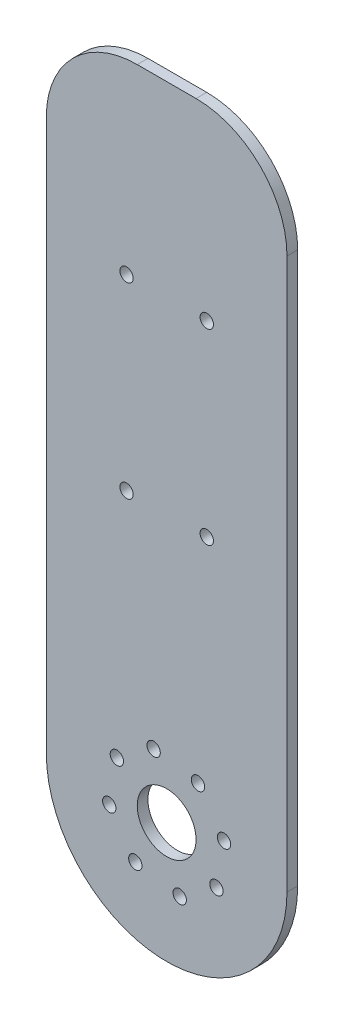
ISO-10303-21;
HEADER;
FILE_DESCRIPTION(('STEP AP214'),'2;1');
FILE_NAME('part.step','',(''),(''),'','','');
FILE_SCHEMA(('AUTOMOTIVE_DESIGN { 1 0 10303 214 1 1 1 1 }'));
ENDSEC;
DATA;
#1=APPLICATION_CONTEXT('core data for automotive mechanical design processes');
#2=APPLICATION_PROTOCOL_DEFINITION('international standard','automotive_design',2000,#1);
#3=PRODUCT_CONTEXT('',#1,'mechanical');
#4=PRODUCT('Part','Part','',(#3));
#5=PRODUCT_RELATED_PRODUCT_CATEGORY('part','',(#4));
#6=PRODUCT_DEFINITION_FORMATION('','',#4);
#7=PRODUCT_DEFINITION_CONTEXT('part definition',#1,'design');
#8=PRODUCT_DEFINITION('design','',#6,#7);
#9=PRODUCT_DEFINITION_SHAPE('','',#8);
#10=(LENGTH_UNIT() NAMED_UNIT(*) SI_UNIT(.MILLI.,.METRE.));
#11=(NAMED_UNIT(*) PLANE_ANGLE_UNIT() SI_UNIT($,.RADIAN.));
#12=(NAMED_UNIT(*) SI_UNIT($,.STERADIAN.) SOLID_ANGLE_UNIT());
#13=UNCERTAINTY_MEASURE_WITH_UNIT(LENGTH_MEASURE(1.E-05),#10,'distance_accuracy_value','');
#14=(GEOMETRIC_REPRESENTATION_CONTEXT(3) GLOBAL_UNCERTAINTY_ASSIGNED_CONTEXT((#13)) GLOBAL_UNIT_ASSIGNED_CONTEXT((#10,
#11,#12)) REPRESENTATION_CONTEXT('',''));
#15=CARTESIAN_POINT('',(0.,0.,0.));
#16=DIRECTION('',(0.,0.,1.));
#17=DIRECTION('',(1.,0.,0.));
#18=AXIS2_PLACEMENT_3D('',#15,#16,#17);
#19=CARTESIAN_POINT('',(3.,80.,1.));
#20=DIRECTION('',(0.,0.,1.));
#21=DIRECTION('',(1.,0.,0.));
#22=AXIS2_PLACEMENT_3D('',#19,#20,#21);
#23=CYLINDRICAL_SURFACE('',#22,17.);
#24=DIRECTION('',(0.,0.,1.));
#25=VECTOR('',#24,1.);
#26=CARTESIAN_POINT('',(20.,80.,1.));
#27=LINE('',#26,#25);
#28=CARTESIAN_POINT('',(20.,80.,-1.));
#29=VERTEX_POINT('',#28);
#30=CARTESIAN_POINT('',(20.,80.,1.));
#31=VERTEX_POINT('',#30);
#32=EDGE_CURVE('E11',#29,#31,#27,.T.);
#33=ORIENTED_EDGE('',*,*,#32,.F.);
#34=CARTESIAN_POINT('',(3.,80.,-1.));
#35=DIRECTION('',(0.,0.,1.));
#36=DIRECTION('',(1.,0.,0.));
#37=AXIS2_PLACEMENT_3D('',#34,#35,#36);
#38=CIRCLE('',#37,17.);
#39=CARTESIAN_POINT('',(3.,97.,-1.));
#40=VERTEX_POINT('',#39);
#41=EDGE_CURVE('E105',#29,#40,#38,.T.);
#42=ORIENTED_EDGE('',*,*,#41,.T.);
#43=DIRECTION('',(0.,0.,1.));
#44=VECTOR('',#43,1.);
#45=CARTESIAN_POINT('',(3.,97.,1.));
#46=LINE('',#45,#44);
#47=CARTESIAN_POINT('',(3.,97.,1.));
#48=VERTEX_POINT('',#47);
#49=EDGE_CURVE('E54',#40,#48,#46,.T.);
#50=ORIENTED_EDGE('',*,*,#49,.T.);
#51=CARTESIAN_POINT('',(3.,80.,1.));
#52=DIRECTION('',(0.,0.,1.));
#53=DIRECTION('',(1.,0.,0.));
#54=AXIS2_PLACEMENT_3D('',#51,#52,#53);
#55=CIRCLE('',#54,17.);
#56=EDGE_CURVE('E135',#31,#48,#55,.T.);
#57=ORIENTED_EDGE('',*,*,#56,.F.);
#58=EDGE_LOOP('',(#33,#42,#50,#57));
#59=FACE_BOUND('',#58,.T.);
#60=ADVANCED_FACE('F44',(#59),#23,.T.);
#61=CARTESIAN_POINT('',(-8.,97.,1.));
#62=DIRECTION('',(0.,1.,0.));
#63=DIRECTION('',(-1.,0.,0.));
#64=AXIS2_PLACEMENT_3D('',#61,#62,#63);
#65=PLANE('',#64);
#66=ORIENTED_EDGE('',*,*,#49,.F.);
#67=DIRECTION('',(1.,0.,0.));
#68=VECTOR('',#67,1.);
#69=CARTESIAN_POINT('',(-2.5,97.,-1.));
#70=LINE('',#69,#68);
#71=CARTESIAN_POINT('',(-8.,97.,-1.));
#72=VERTEX_POINT('',#71);
#73=EDGE_CURVE('E121',#40,#72,#70,.F.);
#74=ORIENTED_EDGE('',*,*,#73,.T.);
#75=DIRECTION('',(0.,0.,1.));
#76=VECTOR('',#75,1.);
#77=CARTESIAN_POINT('',(-8.,97.,1.));
#78=LINE('',#77,#76);
#79=CARTESIAN_POINT('',(-8.,97.,1.));
#80=VERTEX_POINT('',#79);
#81=EDGE_CURVE('E128',#72,#80,#78,.T.);
#82=ORIENTED_EDGE('',*,*,#81,.T.);
#83=DIRECTION('',(-1.,0.,0.));
#84=VECTOR('',#83,1.);
#85=CARTESIAN_POINT('',(-8.,97.,1.));
#86=LINE('',#85,#84);
#87=EDGE_CURVE('E143',#48,#80,#86,.T.);
#88=ORIENTED_EDGE('',*,*,#87,.F.);
#89=EDGE_LOOP('',(#66,#74,#82,#88));
#90=FACE_BOUND('',#89,.T.);
#91=ADVANCED_FACE('F146',(#90),#65,.T.);
#92=CARTESIAN_POINT('',(-8.,80.,1.));
#93=DIRECTION('',(0.,0.,1.));
#94=DIRECTION('',(1.,0.,0.));
#95=AXIS2_PLACEMENT_3D('',#92,#93,#94);
#96=CYLINDRICAL_SURFACE('',#95,17.);
#97=ORIENTED_EDGE('',*,*,#81,.F.);
#98=CARTESIAN_POINT('',(-8.,80.,-1.));
#99=DIRECTION('',(0.,0.,1.));
#100=DIRECTION('',(1.,0.,0.));
#101=AXIS2_PLACEMENT_3D('',#98,#99,#100);
#102=CIRCLE('',#101,17.);
#103=CARTESIAN_POINT('',(-25.,80.,-1.));
#104=VERTEX_POINT('',#103);
#105=EDGE_CURVE('E118',#72,#104,#102,.T.);
#106=ORIENTED_EDGE('',*,*,#105,.T.);
#107=DIRECTION('',(0.,0.,1.));
#108=VECTOR('',#107,1.);
#109=CARTESIAN_POINT('',(-25.,80.,1.));
#110=LINE('',#109,#108);
#111=CARTESIAN_POINT('',(-25.,80.,1.));
#112=VERTEX_POINT('',#111);
#113=EDGE_CURVE('E126',#104,#112,#110,.T.);
#114=ORIENTED_EDGE('',*,*,#113,.T.);
#115=CARTESIAN_POINT('',(-8.,80.,1.));
#116=DIRECTION('',(0.,0.,1.));
#117=DIRECTION('',(-1.,0.,0.));
#118=AXIS2_PLACEMENT_3D('',#115,#116,#117);
#119=CIRCLE('',#118,17.);
#120=EDGE_CURVE('E147',#80,#112,#119,.T.);
#121=ORIENTED_EDGE('',*,*,#120,.F.);
#122=EDGE_LOOP('',(#97,#106,#114,#121));
#123=FACE_BOUND('',#122,.T.);
#124=ADVANCED_FACE('F214',(#123),#96,.T.);
#125=CARTESIAN_POINT('',(-25.,-23.,1.));
#126=DIRECTION('',(-1.,0.,0.));
#127=DIRECTION('',(0.,-1.,0.));
#128=AXIS2_PLACEMENT_3D('',#125,#126,#127);
#129=PLANE('',#128);
#130=ORIENTED_EDGE('',*,*,#113,.F.);
#131=DIRECTION('',(0.,1.,0.));
#132=VECTOR('',#131,1.);
#133=CARTESIAN_POINT('',(-25.,-23.,-1.));
#134=LINE('',#133,#132);
#135=CARTESIAN_POINT('',(-25.,-23.,-1.));
#136=VERTEX_POINT('',#135);
#137=EDGE_CURVE('E115',#104,#136,#134,.F.);
#138=ORIENTED_EDGE('',*,*,#137,.T.);
#139=DIRECTION('',(0.,0.,1.));
#140=VECTOR('',#139,1.);
#141=CARTESIAN_POINT('',(-25.,-23.,1.));
#142=LINE('',#141,#140);
#143=CARTESIAN_POINT('',(-25.,-23.,1.));
#144=VERTEX_POINT('',#143);
#145=EDGE_CURVE('E62',#136,#144,#142,.T.);
#146=ORIENTED_EDGE('',*,*,#145,.T.);
#147=DIRECTION('',(0.,-1.,0.));
#148=VECTOR('',#147,1.);
#149=CARTESIAN_POINT('',(-25.,-23.,1.));
#150=LINE('',#149,#148);
#151=EDGE_CURVE('E98',#112,#144,#150,.T.);
#152=ORIENTED_EDGE('',*,*,#151,.F.);
#153=EDGE_LOOP('',(#130,#138,#146,#152));
#154=FACE_BOUND('',#153,.T.);
#155=ADVANCED_FACE('F219',(#154),#129,.T.);
#156=CARTESIAN_POINT('',(-2.5,-23.,1.));
#157=DIRECTION('',(0.,0.,1.));
#158=DIRECTION('',(1.,0.,0.));
#159=AXIS2_PLACEMENT_3D('',#156,#157,#158);
#160=CYLINDRICAL_SURFACE('',#159,22.5);
#161=ORIENTED_EDGE('',*,*,#145,.F.);
#162=CARTESIAN_POINT('',(-2.5,-23.,-1.));
#163=DIRECTION('',(0.,0.,1.));
#164=DIRECTION('',(1.,0.,0.));
#165=AXIS2_PLACEMENT_3D('',#162,#163,#164);
#166=CIRCLE('',#165,22.5);
#167=CARTESIAN_POINT('',(20.,-23.,-1.));
#168=VERTEX_POINT('',#167);
#169=EDGE_CURVE('E103',#136,#168,#166,.T.);
#170=ORIENTED_EDGE('',*,*,#169,.T.);
#171=DIRECTION('',(0.,0.,1.));
#172=VECTOR('',#171,1.);
#173=CARTESIAN_POINT('',(20.,-23.,1.));
#174=LINE('',#173,#172);
#175=CARTESIAN_POINT('',(20.,-23.,1.));
#176=VERTEX_POINT('',#175);
#177=EDGE_CURVE('E48',#168,#176,#174,.T.);
#178=ORIENTED_EDGE('',*,*,#177,.T.);
#179=CARTESIAN_POINT('',(-2.5,-23.,1.));
#180=DIRECTION('',(0.,0.,1.));
#181=DIRECTION('',(1.,0.,0.));
#182=AXIS2_PLACEMENT_3D('',#179,#180,#181);
#183=CIRCLE('',#182,22.5);
#184=EDGE_CURVE('E295',#144,#176,#183,.T.);
#185=ORIENTED_EDGE('',*,*,#184,.F.);
#186=EDGE_LOOP('',(#161,#170,#178,#185));
#187=FACE_BOUND('',#186,.T.);
#188=ADVANCED_FACE('F107',(#187),#160,.T.);
#189=CARTESIAN_POINT('',(-10.,27.,1.));
#190=DIRECTION('',(0.,0.,1.));
#191=DIRECTION('',(1.,0.,0.));
#192=AXIS2_PLACEMENT_3D('',#189,#190,#191);
#193=CYLINDRICAL_SURFACE('',#192,1.25);
#194=CARTESIAN_POINT('',(-10.,27.,1.));
#195=DIRECTION('',(0.,0.,1.));
#196=DIRECTION('',(1.,0.,0.));
#197=AXIS2_PLACEMENT_3D('',#194,#195,#196);
#198=CIRCLE('',#197,1.25);
#199=CARTESIAN_POINT('',(-8.75,27.,1.));
#200=VERTEX_POINT('',#199);
#201=EDGE_CURVE('E117',#200,#200,#198,.T.);
#202=ORIENTED_EDGE('',*,*,#201,.T.);
#203=EDGE_LOOP('',(#202));
#204=FACE_BOUND('',#203,.T.);
#205=CARTESIAN_POINT('',(-10.,27.,-1.));
#206=DIRECTION('',(0.,0.,1.));
#207=DIRECTION('',(1.,0.,0.));
#208=AXIS2_PLACEMENT_3D('',#205,#206,#207);
#209=CIRCLE('',#208,1.25);
#210=CARTESIAN_POINT('',(-8.75,27.,-1.));
#211=VERTEX_POINT('',#210);
#212=EDGE_CURVE('E154',#211,#211,#209,.T.);
#213=ORIENTED_EDGE('',*,*,#212,.F.);
#214=EDGE_LOOP('',(#213));
#215=FACE_BOUND('',#214,.T.);
#216=ADVANCED_FACE('F223',(#204,#215),#193,.F.);
#217=CARTESIAN_POINT('',(5.,62.,1.));
#218=DIRECTION('',(0.,0.,1.));
#219=DIRECTION('',(1.,0.,0.));
#220=AXIS2_PLACEMENT_3D('',#217,#218,#219);
#221=CYLINDRICAL_SURFACE('',#220,1.25);
#222=CARTESIAN_POINT('',(5.,62.,1.));
#223=DIRECTION('',(0.,0.,1.));
#224=DIRECTION('',(1.,0.,0.));
#225=AXIS2_PLACEMENT_3D('',#222,#223,#224);
#226=CIRCLE('',#225,1.25);
#227=CARTESIAN_POINT('',(6.25,62.,1.));
#228=VERTEX_POINT('',#227);
#229=EDGE_CURVE('E309',#228,#228,#226,.T.);
#230=ORIENTED_EDGE('',*,*,#229,.T.);
#231=EDGE_LOOP('',(#230));
#232=FACE_BOUND('',#231,.T.);
#233=CARTESIAN_POINT('',(5.,62.,-1.));
#234=DIRECTION('',(0.,0.,1.));
#235=DIRECTION('',(1.,0.,0.));
#236=AXIS2_PLACEMENT_3D('',#233,#234,#235);
#237=CIRCLE('',#236,1.25);
#238=CARTESIAN_POINT('',(6.25,62.,-1.));
#239=VERTEX_POINT('',#238);
#240=EDGE_CURVE('E157',#239,#239,#237,.T.);
#241=ORIENTED_EDGE('',*,*,#240,.F.);
#242=EDGE_LOOP('',(#241));
#243=FACE_BOUND('',#242,.T.);
#244=ADVANCED_FACE('F227',(#232,#243),#221,.F.);
#245=CARTESIAN_POINT('',(5.,27.,1.));
#246=DIRECTION('',(0.,0.,1.));
#247=DIRECTION('',(1.,0.,0.));
#248=AXIS2_PLACEMENT_3D('',#245,#246,#247);
#249=CYLINDRICAL_SURFACE('',#248,1.25);
#250=CARTESIAN_POINT('',(5.,27.,1.));
#251=DIRECTION('',(0.,0.,1.));
#252=DIRECTION('',(1.,0.,0.));
#253=AXIS2_PLACEMENT_3D('',#250,#251,#252);
#254=CIRCLE('',#253,1.25);
#255=CARTESIAN_POINT('',(6.25,27.,1.));
#256=VERTEX_POINT('',#255);
#257=EDGE_CURVE('E313',#256,#256,#254,.T.);
#258=ORIENTED_EDGE('',*,*,#257,.T.);
#259=EDGE_LOOP('',(#258));
#260=FACE_BOUND('',#259,.T.);
#261=CARTESIAN_POINT('',(5.,27.,-1.));
#262=DIRECTION('',(0.,0.,1.));
#263=DIRECTION('',(1.,0.,0.));
#264=AXIS2_PLACEMENT_3D('',#261,#262,#263);
#265=CIRCLE('',#264,1.25);
#266=CARTESIAN_POINT('',(6.25,27.,-1.));
#267=VERTEX_POINT('',#266);
#268=EDGE_CURVE('E160',#267,#267,#265,.T.);
#269=ORIENTED_EDGE('',*,*,#268,.F.);
#270=EDGE_LOOP('',(#269));
#271=FACE_BOUND('',#270,.T.);
#272=ADVANCED_FACE('F233',(#260,#271),#249,.F.);
#273=CARTESIAN_POINT('',(-10.,62.,1.));
#274=DIRECTION('',(0.,0.,1.));
#275=DIRECTION('',(1.,0.,0.));
#276=AXIS2_PLACEMENT_3D('',#273,#274,#275);
#277=CYLINDRICAL_SURFACE('',#276,1.25);
#278=CARTESIAN_POINT('',(-10.,62.,1.));
#279=DIRECTION('',(0.,0.,1.));
#280=DIRECTION('',(1.,0.,0.));
#281=AXIS2_PLACEMENT_3D('',#278,#279,#280);
#282=CIRCLE('',#281,1.25);
#283=CARTESIAN_POINT('',(-8.75,62.,1.));
#284=VERTEX_POINT('',#283);
#285=EDGE_CURVE('E317',#284,#284,#282,.T.);
#286=ORIENTED_EDGE('',*,*,#285,.T.);
#287=EDGE_LOOP('',(#286));
#288=FACE_BOUND('',#287,.T.);
#289=CARTESIAN_POINT('',(-10.,62.,-1.));
#290=DIRECTION('',(0.,0.,1.));
#291=DIRECTION('',(1.,0.,0.));
#292=AXIS2_PLACEMENT_3D('',#289,#290,#291);
#293=CIRCLE('',#292,1.25);
#294=CARTESIAN_POINT('',(-8.75,62.,-1.));
#295=VERTEX_POINT('',#294);
#296=EDGE_CURVE('E163',#295,#295,#293,.T.);
#297=ORIENTED_EDGE('',*,*,#296,.F.);
#298=EDGE_LOOP('',(#297));
#299=FACE_BOUND('',#298,.T.);
#300=ADVANCED_FACE('F242',(#288,#299),#277,.F.);
#301=CARTESIAN_POINT('',(-8.36094596654753,-32.3085612409873,1.));
#302=DIRECTION('',(0.,0.,1.));
#303=DIRECTION('',(1.,0.,0.));
#304=AXIS2_PLACEMENT_3D('',#301,#302,#303);
#305=CYLINDRICAL_SURFACE('',#304,1.25);
#306=CARTESIAN_POINT('',(-8.36094596654753,-32.3085612409873,1.));
#307=DIRECTION('',(0.,0.,-1.));
#308=DIRECTION('',(-1.,0.,0.));
#309=AXIS2_PLACEMENT_3D('',#306,#307,#308);
#310=CIRCLE('',#309,1.25);
#311=CARTESIAN_POINT('',(-9.61094596654753,-32.3085612409873,1.));
#312=VERTEX_POINT('',#311);
#313=EDGE_CURVE('E321',#312,#312,#310,.T.);
#314=ORIENTED_EDGE('',*,*,#313,.F.);
#315=EDGE_LOOP('',(#314));
#316=FACE_BOUND('',#315,.T.);
#317=CARTESIAN_POINT('',(-8.36094596654753,-32.3085612409873,-1.));
#318=DIRECTION('',(0.,0.,-1.));
#319=DIRECTION('',(-1.,0.,0.));
#320=AXIS2_PLACEMENT_3D('',#317,#318,#319);
#321=CIRCLE('',#320,1.25);
#322=CARTESIAN_POINT('',(-9.61094596654753,-32.3085612409873,-1.));
#323=VERTEX_POINT('',#322);
#324=EDGE_CURVE('E166',#323,#323,#321,.T.);
#325=ORIENTED_EDGE('',*,*,#324,.T.);
#326=EDGE_LOOP('',(#325));
#327=FACE_BOUND('',#326,.T.);
#328=ADVANCED_FACE('F246',(#316,#327),#305,.F.);
#329=CARTESIAN_POINT('',(-13.2264614137061,-25.4378321394787,1.));
#330=DIRECTION('',(0.,0.,1.));
#331=DIRECTION('',(1.,0.,0.));
#332=AXIS2_PLACEMENT_3D('',#329,#330,#331);
#333=CYLINDRICAL_SURFACE('',#332,1.25);
#334=CARTESIAN_POINT('',(-13.2264614137061,-25.4378321394787,1.));
#335=DIRECTION('',(0.,0.,-1.));
#336=DIRECTION('',(-1.,0.,0.));
#337=AXIS2_PLACEMENT_3D('',#334,#335,#336);
#338=CIRCLE('',#337,1.25);
#339=CARTESIAN_POINT('',(-14.4764614137061,-25.4378321394787,1.));
#340=VERTEX_POINT('',#339);
#341=EDGE_CURVE('E325',#340,#340,#338,.T.);
#342=ORIENTED_EDGE('',*,*,#341,.F.);
#343=EDGE_LOOP('',(#342));
#344=FACE_BOUND('',#343,.T.);
#345=CARTESIAN_POINT('',(-13.2264614137061,-25.4378321394787,-1.));
#346=DIRECTION('',(0.,0.,-1.));
#347=DIRECTION('',(-1.,0.,0.));
#348=AXIS2_PLACEMENT_3D('',#345,#346,#347);
#349=CIRCLE('',#348,1.25);
#350=CARTESIAN_POINT('',(-14.4764614137061,-25.4378321394787,-1.));
#351=VERTEX_POINT('',#350);
#352=EDGE_CURVE('E169',#351,#351,#349,.T.);
#353=ORIENTED_EDGE('',*,*,#352,.T.);
#354=EDGE_LOOP('',(#353));
#355=FACE_BOUND('',#354,.T.);
#356=ADVANCED_FACE('F250',(#344,#355),#333,.F.);
#357=CARTESIAN_POINT('',(-11.8085612409873,-17.1390540334525,1.));
#358=DIRECTION('',(0.,0.,1.));
#359=DIRECTION('',(1.,0.,0.));
#360=AXIS2_PLACEMENT_3D('',#357,#358,#359);
#361=CYLINDRICAL_SURFACE('',#360,1.25);
#362=CARTESIAN_POINT('',(-11.8085612409873,-17.1390540334525,1.));
#363=DIRECTION('',(0.,0.,-1.));
#364=DIRECTION('',(-1.,0.,0.));
#365=AXIS2_PLACEMENT_3D('',#362,#363,#364);
#366=CIRCLE('',#365,1.25);
#367=CARTESIAN_POINT('',(-13.0585612409873,-17.1390540334525,1.));
#368=VERTEX_POINT('',#367);
#369=EDGE_CURVE('E329',#368,#368,#366,.T.);
#370=ORIENTED_EDGE('',*,*,#369,.F.);
#371=EDGE_LOOP('',(#370));
#372=FACE_BOUND('',#371,.T.);
#373=CARTESIAN_POINT('',(-11.8085612409873,-17.1390540334525,-1.));
#374=DIRECTION('',(0.,0.,-1.));
#375=DIRECTION('',(-1.,0.,0.));
#376=AXIS2_PLACEMENT_3D('',#373,#374,#375);
#377=CIRCLE('',#376,1.25);
#378=CARTESIAN_POINT('',(-13.0585612409873,-17.1390540334525,-1.));
#379=VERTEX_POINT('',#378);
#380=EDGE_CURVE('E172',#379,#379,#377,.T.);
#381=ORIENTED_EDGE('',*,*,#380,.T.);
#382=EDGE_LOOP('',(#381));
#383=FACE_BOUND('',#382,.T.);
#384=ADVANCED_FACE('F254',(#372,#383),#361,.F.);
#385=CARTESIAN_POINT('',(-4.93783213947865,-12.273538586294,1.));
#386=DIRECTION('',(0.,0.,1.));
#387=DIRECTION('',(1.,0.,0.));
#388=AXIS2_PLACEMENT_3D('',#385,#386,#387);
#389=CYLINDRICAL_SURFACE('',#388,1.25);
#390=CARTESIAN_POINT('',(-4.93783213947865,-12.273538586294,1.));
#391=DIRECTION('',(0.,0.,-1.));
#392=DIRECTION('',(-1.,0.,0.));
#393=AXIS2_PLACEMENT_3D('',#390,#391,#392);
#394=CIRCLE('',#393,1.25);
#395=CARTESIAN_POINT('',(-6.18783213947865,-12.273538586294,1.));
#396=VERTEX_POINT('',#395);
#397=EDGE_CURVE('E333',#396,#396,#394,.T.);
#398=ORIENTED_EDGE('',*,*,#397,.F.);
#399=EDGE_LOOP('',(#398));
#400=FACE_BOUND('',#399,.T.);
#401=CARTESIAN_POINT('',(-4.93783213947865,-12.273538586294,-1.));
#402=DIRECTION('',(0.,0.,-1.));
#403=DIRECTION('',(-1.,0.,0.));
#404=AXIS2_PLACEMENT_3D('',#401,#402,#403);
#405=CIRCLE('',#404,1.25);
#406=CARTESIAN_POINT('',(-6.18783213947865,-12.273538586294,-1.));
#407=VERTEX_POINT('',#406);
#408=EDGE_CURVE('E175',#407,#407,#405,.T.);
#409=ORIENTED_EDGE('',*,*,#408,.T.);
#410=EDGE_LOOP('',(#409));
#411=FACE_BOUND('',#410,.T.);
#412=ADVANCED_FACE('F258',(#400,#411),#389,.F.);
#413=CARTESIAN_POINT('',(3.36094596654752,-13.6914387590128,1.));
#414=DIRECTION('',(0.,0.,1.));
#415=DIRECTION('',(1.,0.,0.));
#416=AXIS2_PLACEMENT_3D('',#413,#414,#415);
#417=CYLINDRICAL_SURFACE('',#416,1.25);
#418=CARTESIAN_POINT('',(3.36094596654752,-13.6914387590128,1.));
#419=DIRECTION('',(0.,0.,-1.));
#420=DIRECTION('',(-1.,0.,0.));
#421=AXIS2_PLACEMENT_3D('',#418,#419,#420);
#422=CIRCLE('',#421,1.25);
#423=CARTESIAN_POINT('',(2.11094596654752,-13.6914387590128,1.));
#424=VERTEX_POINT('',#423);
#425=EDGE_CURVE('E289',#424,#424,#422,.T.);
#426=ORIENTED_EDGE('',*,*,#425,.F.);
#427=EDGE_LOOP('',(#426));
#428=FACE_BOUND('',#427,.T.);
#429=CARTESIAN_POINT('',(3.36094596654752,-13.6914387590128,-1.));
#430=DIRECTION('',(0.,0.,-1.));
#431=DIRECTION('',(-1.,0.,0.));
#432=AXIS2_PLACEMENT_3D('',#429,#430,#431);
#433=CIRCLE('',#432,1.25);
#434=CARTESIAN_POINT('',(2.11094596654752,-13.6914387590128,-1.));
#435=VERTEX_POINT('',#434);
#436=EDGE_CURVE('E178',#435,#435,#433,.T.);
#437=ORIENTED_EDGE('',*,*,#436,.T.);
#438=EDGE_LOOP('',(#437));
#439=FACE_BOUND('',#438,.T.);
#440=ADVANCED_FACE('F262',(#428,#439),#417,.F.);
#441=CARTESIAN_POINT('',(8.22646141370605,-20.5621678605214,1.));
#442=DIRECTION('',(0.,0.,1.));
#443=DIRECTION('',(1.,0.,0.));
#444=AXIS2_PLACEMENT_3D('',#441,#442,#443);
#445=CYLINDRICAL_SURFACE('',#444,1.25);
#446=CARTESIAN_POINT('',(8.22646141370605,-20.5621678605214,1.));
#447=DIRECTION('',(0.,0.,-1.));
#448=DIRECTION('',(-1.,0.,0.));
#449=AXIS2_PLACEMENT_3D('',#446,#447,#448);
#450=CIRCLE('',#449,1.25);
#451=CARTESIAN_POINT('',(6.97646141370605,-20.5621678605214,1.));
#452=VERTEX_POINT('',#451);
#453=EDGE_CURVE('E283',#452,#452,#450,.T.);
#454=ORIENTED_EDGE('',*,*,#453,.F.);
#455=EDGE_LOOP('',(#454));
#456=FACE_BOUND('',#455,.T.);
#457=CARTESIAN_POINT('',(8.22646141370605,-20.5621678605214,-1.));
#458=DIRECTION('',(0.,0.,-1.));
#459=DIRECTION('',(-1.,0.,0.));
#460=AXIS2_PLACEMENT_3D('',#457,#458,#459);
#461=CIRCLE('',#460,1.25);
#462=CARTESIAN_POINT('',(6.97646141370605,-20.5621678605214,-1.));
#463=VERTEX_POINT('',#462);
#464=EDGE_CURVE('E181',#463,#463,#461,.T.);
#465=ORIENTED_EDGE('',*,*,#464,.T.);
#466=EDGE_LOOP('',(#465));
#467=FACE_BOUND('',#466,.T.);
#468=ADVANCED_FACE('F266',(#456,#467),#445,.F.);
#469=CARTESIAN_POINT('',(6.80856124098725,-28.8609459665476,1.));
#470=DIRECTION('',(0.,0.,1.));
#471=DIRECTION('',(1.,0.,0.));
#472=AXIS2_PLACEMENT_3D('',#469,#470,#471);
#473=CYLINDRICAL_SURFACE('',#472,1.25);
#474=CARTESIAN_POINT('',(6.80856124098725,-28.8609459665476,1.));
#475=DIRECTION('',(0.,0.,-1.));
#476=DIRECTION('',(-1.,0.,0.));
#477=AXIS2_PLACEMENT_3D('',#474,#475,#476);
#478=CIRCLE('',#477,1.25);
#479=CARTESIAN_POINT('',(5.55856124098725,-28.8609459665476,1.));
#480=VERTEX_POINT('',#479);
#481=EDGE_CURVE('E278',#480,#480,#478,.T.);
#482=ORIENTED_EDGE('',*,*,#481,.F.);
#483=EDGE_LOOP('',(#482));
#484=FACE_BOUND('',#483,.T.);
#485=CARTESIAN_POINT('',(6.80856124098725,-28.8609459665476,-1.));
#486=DIRECTION('',(0.,0.,-1.));
#487=DIRECTION('',(-1.,0.,0.));
#488=AXIS2_PLACEMENT_3D('',#485,#486,#487);
#489=CIRCLE('',#488,1.25);
#490=CARTESIAN_POINT('',(5.55856124098725,-28.8609459665476,-1.));
#491=VERTEX_POINT('',#490);
#492=EDGE_CURVE('E184',#491,#491,#489,.T.);
#493=ORIENTED_EDGE('',*,*,#492,.T.);
#494=EDGE_LOOP('',(#493));
#495=FACE_BOUND('',#494,.T.);
#496=ADVANCED_FACE('F205',(#484,#495),#473,.F.);
#497=CARTESIAN_POINT('',(-0.0621678605213492,-33.7264614137061,1.));
#498=DIRECTION('',(0.,0.,1.));
#499=DIRECTION('',(1.,0.,0.));
#500=AXIS2_PLACEMENT_3D('',#497,#498,#499);
#501=CYLINDRICAL_SURFACE('',#500,1.25);
#502=CARTESIAN_POINT('',(-0.0621678605213492,-33.7264614137061,1.));
#503=DIRECTION('',(0.,0.,-1.));
#504=DIRECTION('',(-1.,0.,0.));
#505=AXIS2_PLACEMENT_3D('',#502,#503,#504);
#506=CIRCLE('',#505,1.25);
#507=CARTESIAN_POINT('',(-1.31216786052135,-33.7264614137061,1.));
#508=VERTEX_POINT('',#507);
#509=EDGE_CURVE('E282',#508,#508,#506,.T.);
#510=ORIENTED_EDGE('',*,*,#509,.F.);
#511=EDGE_LOOP('',(#510));
#512=FACE_BOUND('',#511,.T.);
#513=CARTESIAN_POINT('',(-0.0621678605213492,-33.7264614137061,-1.));
#514=DIRECTION('',(0.,0.,-1.));
#515=DIRECTION('',(-1.,0.,0.));
#516=AXIS2_PLACEMENT_3D('',#513,#514,#515);
#517=CIRCLE('',#516,1.25);
#518=CARTESIAN_POINT('',(-1.31216786052135,-33.7264614137061,-1.));
#519=VERTEX_POINT('',#518);
#520=EDGE_CURVE('E111',#519,#519,#517,.T.);
#521=ORIENTED_EDGE('',*,*,#520,.T.);
#522=EDGE_LOOP('',(#521));
#523=FACE_BOUND('',#522,.T.);
#524=ADVANCED_FACE('F189',(#512,#523),#501,.F.);
#525=CARTESIAN_POINT('',(-2.5,-23.,1.));
#526=DIRECTION('',(0.,0.,1.));
#527=DIRECTION('',(1.,0.,0.));
#528=AXIS2_PLACEMENT_3D('',#525,#526,#527);
#529=CYLINDRICAL_SURFACE('',#528,5.5);
#530=CARTESIAN_POINT('',(-2.5,-23.,1.));
#531=DIRECTION('',(0.,0.,-1.));
#532=DIRECTION('',(-1.,0.,0.));
#533=AXIS2_PLACEMENT_3D('',#530,#531,#532);
#534=CIRCLE('',#533,5.5);
#535=CARTESIAN_POINT('',(-8.,-23.,1.));
#536=VERTEX_POINT('',#535);
#537=EDGE_CURVE('E286',#536,#536,#534,.T.);
#538=ORIENTED_EDGE('',*,*,#537,.F.);
#539=EDGE_LOOP('',(#538));
#540=FACE_BOUND('',#539,.T.);
#541=CARTESIAN_POINT('',(-2.5,-23.,-1.));
#542=DIRECTION('',(0.,0.,-1.));
#543=DIRECTION('',(-1.,0.,0.));
#544=AXIS2_PLACEMENT_3D('',#541,#542,#543);
#545=CIRCLE('',#544,5.5);
#546=CARTESIAN_POINT('',(-8.,-23.,-1.));
#547=VERTEX_POINT('',#546);
#548=EDGE_CURVE('E108',#547,#547,#545,.T.);
#549=ORIENTED_EDGE('',*,*,#548,.T.);
#550=EDGE_LOOP('',(#549));
#551=FACE_BOUND('',#550,.T.);
#552=ADVANCED_FACE('F197',(#540,#551),#529,.F.);
#553=CARTESIAN_POINT('',(20.,-23.,1.));
#554=DIRECTION('',(1.,0.,0.));
#555=DIRECTION('',(0.,1.,0.));
#556=AXIS2_PLACEMENT_3D('',#553,#554,#555);
#557=PLANE('',#556);
#558=DIRECTION('',(0.,1.,0.));
#559=VECTOR('',#558,1.);
#560=CARTESIAN_POINT('',(20.,-23.,-1.));
#561=LINE('',#560,#559);
#562=EDGE_CURVE('E92',#168,#29,#561,.T.);
#563=ORIENTED_EDGE('',*,*,#562,.T.);
#564=ORIENTED_EDGE('',*,*,#32,.T.);
#565=DIRECTION('',(0.,1.,0.));
#566=VECTOR('',#565,1.);
#567=CARTESIAN_POINT('',(20.,-23.,1.));
#568=LINE('',#567,#566);
#569=EDGE_CURVE('E94',#176,#31,#568,.T.);
#570=ORIENTED_EDGE('',*,*,#569,.F.);
#571=ORIENTED_EDGE('',*,*,#177,.F.);
#572=EDGE_LOOP('',(#563,#564,#570,#571));
#573=FACE_BOUND('',#572,.T.);
#574=ADVANCED_FACE('F46',(#573),#557,.T.);
#575=CARTESIAN_POINT('',(-2.5,-23.,1.));
#576=DIRECTION('',(0.,0.,1.));
#577=DIRECTION('',(1.,0.,0.));
#578=AXIS2_PLACEMENT_3D('',#575,#576,#577);
#579=PLANE('',#578);
#580=ORIENTED_EDGE('',*,*,#201,.F.);
#581=EDGE_LOOP('',(#580));
#582=FACE_BOUND('',#581,.T.);
#583=ORIENTED_EDGE('',*,*,#229,.F.);
#584=EDGE_LOOP('',(#583));
#585=FACE_BOUND('',#584,.T.);
#586=ORIENTED_EDGE('',*,*,#257,.F.);
#587=EDGE_LOOP('',(#586));
#588=FACE_BOUND('',#587,.T.);
#589=ORIENTED_EDGE('',*,*,#285,.F.);
#590=EDGE_LOOP('',(#589));
#591=FACE_BOUND('',#590,.T.);
#592=ORIENTED_EDGE('',*,*,#313,.T.);
#593=EDGE_LOOP('',(#592));
#594=FACE_BOUND('',#593,.T.);
#595=ORIENTED_EDGE('',*,*,#341,.T.);
#596=EDGE_LOOP('',(#595));
#597=FACE_BOUND('',#596,.T.);
#598=ORIENTED_EDGE('',*,*,#369,.T.);
#599=EDGE_LOOP('',(#598));
#600=FACE_BOUND('',#599,.T.);
#601=ORIENTED_EDGE('',*,*,#397,.T.);
#602=EDGE_LOOP('',(#601));
#603=FACE_BOUND('',#602,.T.);
#604=ORIENTED_EDGE('',*,*,#425,.T.);
#605=EDGE_LOOP('',(#604));
#606=FACE_BOUND('',#605,.T.);
#607=ORIENTED_EDGE('',*,*,#453,.T.);
#608=EDGE_LOOP('',(#607));
#609=FACE_BOUND('',#608,.T.);
#610=ORIENTED_EDGE('',*,*,#481,.T.);
#611=EDGE_LOOP('',(#610));
#612=FACE_BOUND('',#611,.T.);
#613=ORIENTED_EDGE('',*,*,#509,.T.);
#614=EDGE_LOOP('',(#613));
#615=FACE_BOUND('',#614,.T.);
#616=ORIENTED_EDGE('',*,*,#537,.T.);
#617=EDGE_LOOP('',(#616));
#618=FACE_BOUND('',#617,.T.);
#619=ORIENTED_EDGE('',*,*,#184,.T.);
#620=ORIENTED_EDGE('',*,*,#569,.T.);
#621=ORIENTED_EDGE('',*,*,#56,.T.);
#622=ORIENTED_EDGE('',*,*,#87,.T.);
#623=ORIENTED_EDGE('',*,*,#120,.T.);
#624=ORIENTED_EDGE('',*,*,#151,.T.);
#625=EDGE_LOOP('',(#619,#620,#621,#622,#623,#624));
#626=FACE_BOUND('',#625,.T.);
#627=ADVANCED_FACE('F141',(#582,#585,#588,#591,#594,#597,#600,#603,#606,#609,#612,#615,#618,
#626),#579,.T.);
#628=CARTESIAN_POINT('',(-2.5,-23.,-1.));
#629=DIRECTION('',(0.,0.,1.));
#630=DIRECTION('',(1.,0.,0.));
#631=AXIS2_PLACEMENT_3D('',#628,#629,#630);
#632=PLANE('',#631);
#633=ORIENTED_EDGE('',*,*,#212,.T.);
#634=EDGE_LOOP('',(#633));
#635=FACE_BOUND('',#634,.T.);
#636=ORIENTED_EDGE('',*,*,#240,.T.);
#637=EDGE_LOOP('',(#636));
#638=FACE_BOUND('',#637,.T.);
#639=ORIENTED_EDGE('',*,*,#268,.T.);
#640=EDGE_LOOP('',(#639));
#641=FACE_BOUND('',#640,.T.);
#642=ORIENTED_EDGE('',*,*,#296,.T.);
#643=EDGE_LOOP('',(#642));
#644=FACE_BOUND('',#643,.T.);
#645=ORIENTED_EDGE('',*,*,#324,.F.);
#646=EDGE_LOOP('',(#645));
#647=FACE_BOUND('',#646,.T.);
#648=ORIENTED_EDGE('',*,*,#352,.F.);
#649=EDGE_LOOP('',(#648));
#650=FACE_BOUND('',#649,.T.);
#651=ORIENTED_EDGE('',*,*,#380,.F.);
#652=EDGE_LOOP('',(#651));
#653=FACE_BOUND('',#652,.T.);
#654=ORIENTED_EDGE('',*,*,#408,.F.);
#655=EDGE_LOOP('',(#654));
#656=FACE_BOUND('',#655,.T.);
#657=ORIENTED_EDGE('',*,*,#436,.F.);
#658=EDGE_LOOP('',(#657));
#659=FACE_BOUND('',#658,.T.);
#660=ORIENTED_EDGE('',*,*,#464,.F.);
#661=EDGE_LOOP('',(#660));
#662=FACE_BOUND('',#661,.T.);
#663=ORIENTED_EDGE('',*,*,#492,.F.);
#664=EDGE_LOOP('',(#663));
#665=FACE_BOUND('',#664,.T.);
#666=ORIENTED_EDGE('',*,*,#520,.F.);
#667=EDGE_LOOP('',(#666));
#668=FACE_BOUND('',#667,.T.);
#669=ORIENTED_EDGE('',*,*,#548,.F.);
#670=EDGE_LOOP('',(#669));
#671=FACE_BOUND('',#670,.T.);
#672=ORIENTED_EDGE('',*,*,#169,.F.);
#673=ORIENTED_EDGE('',*,*,#137,.F.);
#674=ORIENTED_EDGE('',*,*,#105,.F.);
#675=ORIENTED_EDGE('',*,*,#73,.F.);
#676=ORIENTED_EDGE('',*,*,#41,.F.);
#677=ORIENTED_EDGE('',*,*,#562,.F.);
#678=EDGE_LOOP('',(#672,#673,#674,#675,#676,#677));
#679=FACE_BOUND('',#678,.T.);
#680=ADVANCED_FACE('F101',(#635,#638,#641,#644,#647,#650,#653,#656,#659,#662,#665,#668,#671,
#679),#632,.F.);
#681=CLOSED_SHELL('',(#60,#91,#124,#155,#188,#216,#244,#272,#300,#328,#356,#384,#412,#440,#468,
#496,#524,#552,#574,#627,#680));
#682=MANIFOLD_SOLID_BREP('B2',#681);
#683=ADVANCED_BREP_SHAPE_REPRESENTATION('',(#18,#682),#14);
#684=SHAPE_DEFINITION_REPRESENTATION(#9,#683);
ENDSEC;
END-ISO-10303-21;
